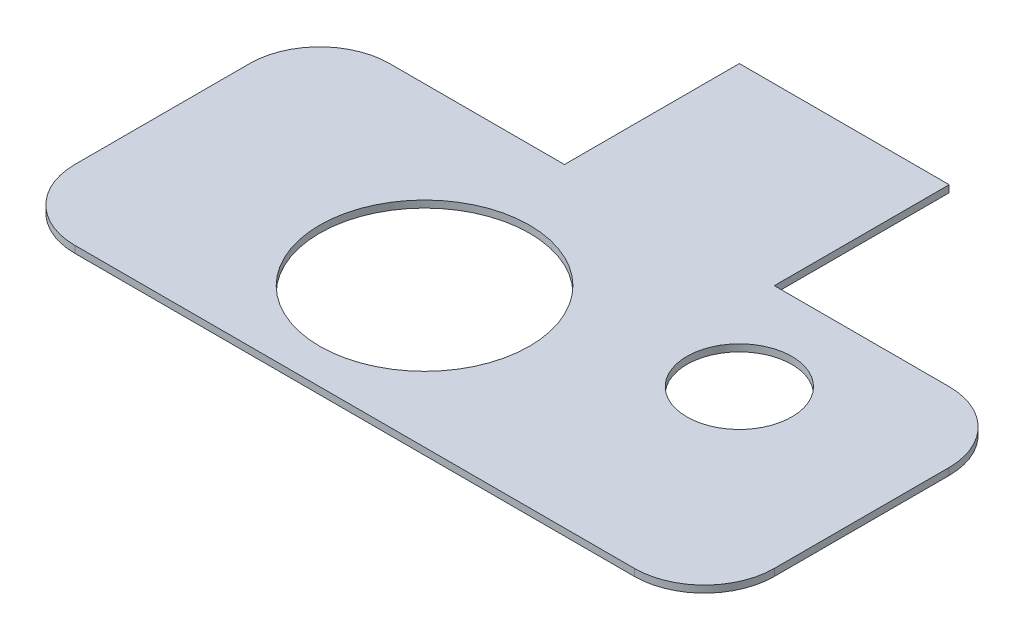
ISO-10303-21;
HEADER;
FILE_DESCRIPTION(('STEP AP214'),'2;1');
FILE_NAME('part.step','',(''),(''),'','','');
FILE_SCHEMA(('AUTOMOTIVE_DESIGN { 1 0 10303 214 1 1 1 1 }'));
ENDSEC;
DATA;
#1=APPLICATION_CONTEXT('core data for automotive mechanical design processes');
#2=APPLICATION_PROTOCOL_DEFINITION('international standard','automotive_design',2000,#1);
#3=PRODUCT_CONTEXT('',#1,'mechanical');
#4=PRODUCT('Part','Part','',(#3));
#5=PRODUCT_RELATED_PRODUCT_CATEGORY('part','',(#4));
#6=PRODUCT_DEFINITION_FORMATION('','',#4);
#7=PRODUCT_DEFINITION_CONTEXT('part definition',#1,'design');
#8=PRODUCT_DEFINITION('design','',#6,#7);
#9=PRODUCT_DEFINITION_SHAPE('','',#8);
#10=(LENGTH_UNIT() NAMED_UNIT(*) SI_UNIT(.MILLI.,.METRE.));
#11=(NAMED_UNIT(*) PLANE_ANGLE_UNIT() SI_UNIT($,.RADIAN.));
#12=(NAMED_UNIT(*) SI_UNIT($,.STERADIAN.) SOLID_ANGLE_UNIT());
#13=UNCERTAINTY_MEASURE_WITH_UNIT(LENGTH_MEASURE(1.E-05),#10,'distance_accuracy_value','');
#14=(GEOMETRIC_REPRESENTATION_CONTEXT(3) GLOBAL_UNCERTAINTY_ASSIGNED_CONTEXT((#13)) GLOBAL_UNIT_ASSIGNED_CONTEXT((#10,
#11,#12)) REPRESENTATION_CONTEXT('',''));
#15=CARTESIAN_POINT('',(0.,0.,0.));
#16=DIRECTION('',(0.,0.,1.));
#17=DIRECTION('',(1.,0.,0.));
#18=AXIS2_PLACEMENT_3D('',#15,#16,#17);
#19=CARTESIAN_POINT('',(90.,1.,-35.));
#20=DIRECTION('',(0.,-1.,0.));
#21=DIRECTION('',(0.,0.,-1.));
#22=AXIS2_PLACEMENT_3D('',#19,#20,#21);
#23=PLANE('',#22);
#24=DIRECTION('',(0.,0.,1.));
#25=VECTOR('',#24,1.);
#26=CARTESIAN_POINT('',(35.,1.,-45.));
#27=LINE('',#26,#25);
#28=CARTESIAN_POINT('',(35.,1.,-70.));
#29=VERTEX_POINT('',#28);
#30=CARTESIAN_POINT('',(35.,1.,-45.));
#31=VERTEX_POINT('',#30);
#32=EDGE_CURVE('E181',#29,#31,#27,.T.);
#33=ORIENTED_EDGE('',*,*,#32,.T.);
#34=DIRECTION('',(-1.,0.,0.));
#35=VECTOR('',#34,1.);
#36=CARTESIAN_POINT('',(10.0000000000001,1.,-45.));
#37=LINE('',#36,#35);
#38=CARTESIAN_POINT('',(10.0000000000001,1.,-45.));
#39=VERTEX_POINT('',#38);
#40=EDGE_CURVE('E109',#31,#39,#37,.T.);
#41=ORIENTED_EDGE('',*,*,#40,.T.);
#42=CARTESIAN_POINT('',(10.,1.,-35.));
#43=DIRECTION('',(0.,1.,0.));
#44=DIRECTION('',(0.,0.,-1.));
#45=AXIS2_PLACEMENT_3D('',#42,#43,#44);
#46=CIRCLE('',#45,10.);
#47=CARTESIAN_POINT('',(0.,1.,-34.9999999999999));
#48=VERTEX_POINT('',#47);
#49=EDGE_CURVE('E208',#39,#48,#46,.T.);
#50=ORIENTED_EDGE('',*,*,#49,.T.);
#51=DIRECTION('',(0.,0.,1.));
#52=VECTOR('',#51,1.);
#53=CARTESIAN_POINT('',(0.,1.,-10.0000000000001));
#54=LINE('',#53,#52);
#55=CARTESIAN_POINT('',(0.,1.,-10.0000000000001));
#56=VERTEX_POINT('',#55);
#57=EDGE_CURVE('E227',#48,#56,#54,.T.);
#58=ORIENTED_EDGE('',*,*,#57,.T.);
#59=CARTESIAN_POINT('',(10.,1.,-10.));
#60=DIRECTION('',(0.,1.,0.));
#61=DIRECTION('',(0.,0.,-1.));
#62=AXIS2_PLACEMENT_3D('',#59,#60,#61);
#63=CIRCLE('',#62,10.);
#64=CARTESIAN_POINT('',(10.0000000000001,1.,0.));
#65=VERTEX_POINT('',#64);
#66=EDGE_CURVE('E224',#56,#65,#63,.T.);
#67=ORIENTED_EDGE('',*,*,#66,.T.);
#68=DIRECTION('',(1.,0.,0.));
#69=VECTOR('',#68,1.);
#70=CARTESIAN_POINT('',(10.0000000000001,1.,0.));
#71=LINE('',#70,#69);
#72=CARTESIAN_POINT('',(89.9999999999999,1.,0.));
#73=VERTEX_POINT('',#72);
#74=EDGE_CURVE('E226',#65,#73,#71,.T.);
#75=ORIENTED_EDGE('',*,*,#74,.T.);
#76=CARTESIAN_POINT('',(90.,1.,-10.));
#77=DIRECTION('',(0.,1.,0.));
#78=DIRECTION('',(0.,0.,1.));
#79=AXIS2_PLACEMENT_3D('',#76,#77,#78);
#80=CIRCLE('',#79,10.);
#81=CARTESIAN_POINT('',(100.,1.,-10.0000000000001));
#82=VERTEX_POINT('',#81);
#83=EDGE_CURVE('E229',#73,#82,#80,.T.);
#84=ORIENTED_EDGE('',*,*,#83,.T.);
#85=DIRECTION('',(0.,0.,-1.));
#86=VECTOR('',#85,1.);
#87=CARTESIAN_POINT('',(100.,1.,-10.0000000000001));
#88=LINE('',#87,#86);
#89=CARTESIAN_POINT('',(100.,1.,-34.9999999999999));
#90=VERTEX_POINT('',#89);
#91=EDGE_CURVE('E235',#82,#90,#88,.T.);
#92=ORIENTED_EDGE('',*,*,#91,.T.);
#93=CARTESIAN_POINT('',(90.,1.,-35.));
#94=DIRECTION('',(0.,1.,0.));
#95=DIRECTION('',(0.,0.,-1.));
#96=AXIS2_PLACEMENT_3D('',#93,#94,#95);
#97=CIRCLE('',#96,10.);
#98=CARTESIAN_POINT('',(89.9999999999999,1.,-45.));
#99=VERTEX_POINT('',#98);
#100=EDGE_CURVE('E140',#90,#99,#97,.T.);
#101=ORIENTED_EDGE('',*,*,#100,.T.);
#102=DIRECTION('',(-1.,0.,0.));
#103=VECTOR('',#102,1.);
#104=CARTESIAN_POINT('',(65.,1.,-45.));
#105=LINE('',#104,#103);
#106=CARTESIAN_POINT('',(65.,1.,-45.));
#107=VERTEX_POINT('',#106);
#108=EDGE_CURVE('E134',#99,#107,#105,.T.);
#109=ORIENTED_EDGE('',*,*,#108,.T.);
#110=DIRECTION('',(0.,0.,-1.));
#111=VECTOR('',#110,1.);
#112=CARTESIAN_POINT('',(65.,1.,-45.));
#113=LINE('',#112,#111);
#114=CARTESIAN_POINT('',(65.,1.,-70.));
#115=VERTEX_POINT('',#114);
#116=EDGE_CURVE('E138',#107,#115,#113,.T.);
#117=ORIENTED_EDGE('',*,*,#116,.T.);
#118=DIRECTION('',(-1.,0.,0.));
#119=VECTOR('',#118,1.);
#120=CARTESIAN_POINT('',(35.,1.,-70.));
#121=LINE('',#120,#119);
#122=EDGE_CURVE('E54',#115,#29,#121,.T.);
#123=ORIENTED_EDGE('',*,*,#122,.T.);
#124=EDGE_LOOP('',(#33,#41,#50,#58,#67,#75,#84,#92,#101,#109,#117,#123));
#125=FACE_BOUND('',#124,.T.);
#126=CARTESIAN_POINT('',(40.,1.,-20.));
#127=DIRECTION('',(0.,1.,0.));
#128=DIRECTION('',(0.,0.,1.));
#129=AXIS2_PLACEMENT_3D('',#126,#127,#128);
#130=CIRCLE('',#129,15.);
#131=CARTESIAN_POINT('',(40.,1.,-5.));
#132=VERTEX_POINT('',#131);
#133=EDGE_CURVE('E162',#132,#132,#130,.T.);
#134=ORIENTED_EDGE('',*,*,#133,.F.);
#135=EDGE_LOOP('',(#134));
#136=FACE_BOUND('',#135,.T.);
#137=CARTESIAN_POINT('',(75.,1.,-30.));
#138=DIRECTION('',(0.,1.,0.));
#139=DIRECTION('',(0.,0.,1.));
#140=AXIS2_PLACEMENT_3D('',#137,#138,#139);
#141=CIRCLE('',#140,7.50000000000001);
#142=CARTESIAN_POINT('',(75.,1.,-22.5));
#143=VERTEX_POINT('',#142);
#144=EDGE_CURVE('E276',#143,#143,#141,.T.);
#145=ORIENTED_EDGE('',*,*,#144,.F.);
#146=EDGE_LOOP('',(#145));
#147=FACE_BOUND('',#146,.T.);
#148=ADVANCED_FACE('F37',(#125,#136,#147),#23,.F.);
#149=CARTESIAN_POINT('',(90.,0.,-35.));
#150=DIRECTION('',(0.,-1.,0.));
#151=DIRECTION('',(0.,0.,-1.));
#152=AXIS2_PLACEMENT_3D('',#149,#150,#151);
#153=PLANE('',#152);
#154=CARTESIAN_POINT('',(40.,0.,-20.));
#155=DIRECTION('',(0.,1.,0.));
#156=DIRECTION('',(0.,0.,1.));
#157=AXIS2_PLACEMENT_3D('',#154,#155,#156);
#158=CIRCLE('',#157,15.);
#159=CARTESIAN_POINT('',(40.,0.,-5.));
#160=VERTEX_POINT('',#159);
#161=EDGE_CURVE('E281',#160,#160,#158,.T.);
#162=ORIENTED_EDGE('',*,*,#161,.T.);
#163=EDGE_LOOP('',(#162));
#164=FACE_BOUND('',#163,.T.);
#165=DIRECTION('',(0.,0.,1.));
#166=VECTOR('',#165,1.);
#167=CARTESIAN_POINT('',(35.,0.,-45.));
#168=LINE('',#167,#166);
#169=CARTESIAN_POINT('',(35.,0.,-70.));
#170=VERTEX_POINT('',#169);
#171=CARTESIAN_POINT('',(35.,0.,-45.));
#172=VERTEX_POINT('',#171);
#173=EDGE_CURVE('E158',#170,#172,#168,.T.);
#174=ORIENTED_EDGE('',*,*,#173,.F.);
#175=DIRECTION('',(-1.,0.,0.));
#176=VECTOR('',#175,1.);
#177=CARTESIAN_POINT('',(35.,0.,-70.));
#178=LINE('',#177,#176);
#179=CARTESIAN_POINT('',(65.,0.,-70.));
#180=VERTEX_POINT('',#179);
#181=EDGE_CURVE('E101',#180,#170,#178,.T.);
#182=ORIENTED_EDGE('',*,*,#181,.F.);
#183=DIRECTION('',(0.,0.,-1.));
#184=VECTOR('',#183,1.);
#185=CARTESIAN_POINT('',(65.,0.,-45.));
#186=LINE('',#185,#184);
#187=CARTESIAN_POINT('',(65.,0.,-45.));
#188=VERTEX_POINT('',#187);
#189=EDGE_CURVE('E95',#188,#180,#186,.T.);
#190=ORIENTED_EDGE('',*,*,#189,.F.);
#191=DIRECTION('',(-1.,0.,0.));
#192=VECTOR('',#191,1.);
#193=CARTESIAN_POINT('',(65.,0.,-45.));
#194=LINE('',#193,#192);
#195=CARTESIAN_POINT('',(89.9999999999999,0.,-45.));
#196=VERTEX_POINT('',#195);
#197=EDGE_CURVE('E148',#196,#188,#194,.T.);
#198=ORIENTED_EDGE('',*,*,#197,.F.);
#199=CARTESIAN_POINT('',(90.,0.,-35.));
#200=DIRECTION('',(0.,1.,0.));
#201=DIRECTION('',(0.,0.,-1.));
#202=AXIS2_PLACEMENT_3D('',#199,#200,#201);
#203=CIRCLE('',#202,10.);
#204=CARTESIAN_POINT('',(100.,0.,-34.9999999999999));
#205=VERTEX_POINT('',#204);
#206=EDGE_CURVE('E176',#205,#196,#203,.T.);
#207=ORIENTED_EDGE('',*,*,#206,.F.);
#208=DIRECTION('',(0.,0.,-1.));
#209=VECTOR('',#208,1.);
#210=CARTESIAN_POINT('',(100.,0.,-10.0000000000001));
#211=LINE('',#210,#209);
#212=CARTESIAN_POINT('',(100.,0.,-10.0000000000001));
#213=VERTEX_POINT('',#212);
#214=EDGE_CURVE('E174',#213,#205,#211,.T.);
#215=ORIENTED_EDGE('',*,*,#214,.F.);
#216=CARTESIAN_POINT('',(90.,0.,-10.));
#217=DIRECTION('',(0.,1.,0.));
#218=DIRECTION('',(0.,0.,1.));
#219=AXIS2_PLACEMENT_3D('',#216,#217,#218);
#220=CIRCLE('',#219,10.);
#221=CARTESIAN_POINT('',(89.9999999999999,0.,0.));
#222=VERTEX_POINT('',#221);
#223=EDGE_CURVE('E172',#222,#213,#220,.T.);
#224=ORIENTED_EDGE('',*,*,#223,.F.);
#225=DIRECTION('',(1.,0.,0.));
#226=VECTOR('',#225,1.);
#227=CARTESIAN_POINT('',(10.0000000000001,0.,0.));
#228=LINE('',#227,#226);
#229=CARTESIAN_POINT('',(10.0000000000001,0.,0.));
#230=VERTEX_POINT('',#229);
#231=EDGE_CURVE('E170',#230,#222,#228,.T.);
#232=ORIENTED_EDGE('',*,*,#231,.F.);
#233=CARTESIAN_POINT('',(10.,0.,-10.));
#234=DIRECTION('',(0.,1.,0.));
#235=DIRECTION('',(0.,0.,-1.));
#236=AXIS2_PLACEMENT_3D('',#233,#234,#235);
#237=CIRCLE('',#236,10.);
#238=CARTESIAN_POINT('',(0.,0.,-10.0000000000001));
#239=VERTEX_POINT('',#238);
#240=EDGE_CURVE('E168',#239,#230,#237,.T.);
#241=ORIENTED_EDGE('',*,*,#240,.F.);
#242=DIRECTION('',(0.,0.,1.));
#243=VECTOR('',#242,1.);
#244=CARTESIAN_POINT('',(0.,0.,-10.0000000000001));
#245=LINE('',#244,#243);
#246=CARTESIAN_POINT('',(0.,0.,-34.9999999999999));
#247=VERTEX_POINT('',#246);
#248=EDGE_CURVE('E166',#247,#239,#245,.T.);
#249=ORIENTED_EDGE('',*,*,#248,.F.);
#250=CARTESIAN_POINT('',(10.,0.,-35.));
#251=DIRECTION('',(0.,1.,0.));
#252=DIRECTION('',(0.,0.,-1.));
#253=AXIS2_PLACEMENT_3D('',#250,#251,#252);
#254=CIRCLE('',#253,10.);
#255=CARTESIAN_POINT('',(10.0000000000001,0.,-45.));
#256=VERTEX_POINT('',#255);
#257=EDGE_CURVE('E164',#256,#247,#254,.T.);
#258=ORIENTED_EDGE('',*,*,#257,.F.);
#259=DIRECTION('',(-1.,0.,0.));
#260=VECTOR('',#259,1.);
#261=CARTESIAN_POINT('',(10.0000000000001,0.,-45.));
#262=LINE('',#261,#260);
#263=EDGE_CURVE('E161',#172,#256,#262,.T.);
#264=ORIENTED_EDGE('',*,*,#263,.F.);
#265=EDGE_LOOP('',(#174,#182,#190,#198,#207,#215,#224,#232,#241,#249,#258,#264));
#266=FACE_BOUND('',#265,.T.);
#267=CARTESIAN_POINT('',(75.,0.,-30.));
#268=DIRECTION('',(0.,1.,0.));
#269=DIRECTION('',(0.,0.,1.));
#270=AXIS2_PLACEMENT_3D('',#267,#268,#269);
#271=CIRCLE('',#270,7.50000000000001);
#272=CARTESIAN_POINT('',(75.,0.,-22.5));
#273=VERTEX_POINT('',#272);
#274=EDGE_CURVE('E279',#273,#273,#271,.T.);
#275=ORIENTED_EDGE('',*,*,#274,.T.);
#276=EDGE_LOOP('',(#275));
#277=FACE_BOUND('',#276,.T.);
#278=ADVANCED_FACE('F212',(#164,#266,#277),#153,.T.);
#279=CARTESIAN_POINT('',(35.,1.,-45.));
#280=DIRECTION('',(1.,0.,0.));
#281=DIRECTION('',(0.,0.,-1.));
#282=AXIS2_PLACEMENT_3D('',#279,#280,#281);
#283=PLANE('',#282);
#284=ORIENTED_EDGE('',*,*,#173,.T.);
#285=DIRECTION('',(0.,-1.,0.));
#286=VECTOR('',#285,1.);
#287=CARTESIAN_POINT('',(35.,1.,-45.));
#288=LINE('',#287,#286);
#289=EDGE_CURVE('E11',#31,#172,#288,.T.);
#290=ORIENTED_EDGE('',*,*,#289,.F.);
#291=ORIENTED_EDGE('',*,*,#32,.F.);
#292=DIRECTION('',(0.,-1.,0.));
#293=VECTOR('',#292,1.);
#294=CARTESIAN_POINT('',(35.,1.,-70.));
#295=LINE('',#294,#293);
#296=EDGE_CURVE('E154',#29,#170,#295,.T.);
#297=ORIENTED_EDGE('',*,*,#296,.T.);
#298=EDGE_LOOP('',(#284,#290,#291,#297));
#299=FACE_BOUND('',#298,.T.);
#300=ADVANCED_FACE('F39',(#299),#283,.F.);
#301=CARTESIAN_POINT('',(10.0000000000001,1.,-45.));
#302=DIRECTION('',(0.,0.,1.));
#303=DIRECTION('',(1.,0.,0.));
#304=AXIS2_PLACEMENT_3D('',#301,#302,#303);
#305=PLANE('',#304);
#306=ORIENTED_EDGE('',*,*,#263,.T.);
#307=DIRECTION('',(0.,-1.,0.));
#308=VECTOR('',#307,1.);
#309=CARTESIAN_POINT('',(10.0000000000001,1.,-45.));
#310=LINE('',#309,#308);
#311=EDGE_CURVE('E46',#39,#256,#310,.T.);
#312=ORIENTED_EDGE('',*,*,#311,.F.);
#313=ORIENTED_EDGE('',*,*,#40,.F.);
#314=ORIENTED_EDGE('',*,*,#289,.T.);
#315=EDGE_LOOP('',(#306,#312,#313,#314));
#316=FACE_BOUND('',#315,.T.);
#317=ADVANCED_FACE('F376',(#316),#305,.F.);
#318=CARTESIAN_POINT('',(10.,1.,-35.));
#319=DIRECTION('',(0.,-1.,0.));
#320=DIRECTION('',(0.,0.,-1.));
#321=AXIS2_PLACEMENT_3D('',#318,#319,#320);
#322=CYLINDRICAL_SURFACE('',#321,10.);
#323=ORIENTED_EDGE('',*,*,#257,.T.);
#324=DIRECTION('',(0.,-1.,0.));
#325=VECTOR('',#324,1.);
#326=CARTESIAN_POINT('',(0.,1.,-34.9999999999999));
#327=LINE('',#326,#325);
#328=EDGE_CURVE('E200',#48,#247,#327,.T.);
#329=ORIENTED_EDGE('',*,*,#328,.F.);
#330=ORIENTED_EDGE('',*,*,#49,.F.);
#331=ORIENTED_EDGE('',*,*,#311,.T.);
#332=EDGE_LOOP('',(#323,#329,#330,#331));
#333=FACE_BOUND('',#332,.T.);
#334=ADVANCED_FACE('F206',(#333),#322,.T.);
#335=CARTESIAN_POINT('',(0.,1.,-10.0000000000001));
#336=DIRECTION('',(1.,0.,0.));
#337=DIRECTION('',(0.,0.,-1.));
#338=AXIS2_PLACEMENT_3D('',#335,#336,#337);
#339=PLANE('',#338);
#340=ORIENTED_EDGE('',*,*,#248,.T.);
#341=DIRECTION('',(0.,-1.,0.));
#342=VECTOR('',#341,1.);
#343=CARTESIAN_POINT('',(0.,1.,-10.0000000000001));
#344=LINE('',#343,#342);
#345=EDGE_CURVE('E197',#56,#239,#344,.T.);
#346=ORIENTED_EDGE('',*,*,#345,.F.);
#347=ORIENTED_EDGE('',*,*,#57,.F.);
#348=ORIENTED_EDGE('',*,*,#328,.T.);
#349=EDGE_LOOP('',(#340,#346,#347,#348));
#350=FACE_BOUND('',#349,.T.);
#351=ADVANCED_FACE('F218',(#350),#339,.F.);
#352=CARTESIAN_POINT('',(10.,1.,-10.));
#353=DIRECTION('',(0.,-1.,0.));
#354=DIRECTION('',(0.,0.,-1.));
#355=AXIS2_PLACEMENT_3D('',#352,#353,#354);
#356=CYLINDRICAL_SURFACE('',#355,10.);
#357=ORIENTED_EDGE('',*,*,#240,.T.);
#358=DIRECTION('',(0.,-1.,0.));
#359=VECTOR('',#358,1.);
#360=CARTESIAN_POINT('',(10.0000000000001,1.,0.));
#361=LINE('',#360,#359);
#362=EDGE_CURVE('E194',#65,#230,#361,.T.);
#363=ORIENTED_EDGE('',*,*,#362,.F.);
#364=ORIENTED_EDGE('',*,*,#66,.F.);
#365=ORIENTED_EDGE('',*,*,#345,.T.);
#366=EDGE_LOOP('',(#357,#363,#364,#365));
#367=FACE_BOUND('',#366,.T.);
#368=ADVANCED_FACE('F222',(#367),#356,.T.);
#369=CARTESIAN_POINT('',(10.0000000000001,1.,0.));
#370=DIRECTION('',(0.,0.,-1.));
#371=DIRECTION('',(-1.,0.,0.));
#372=AXIS2_PLACEMENT_3D('',#369,#370,#371);
#373=PLANE('',#372);
#374=ORIENTED_EDGE('',*,*,#231,.T.);
#375=DIRECTION('',(0.,-1.,0.));
#376=VECTOR('',#375,1.);
#377=CARTESIAN_POINT('',(89.9999999999999,1.,0.));
#378=LINE('',#377,#376);
#379=EDGE_CURVE('E191',#73,#222,#378,.T.);
#380=ORIENTED_EDGE('',*,*,#379,.F.);
#381=ORIENTED_EDGE('',*,*,#74,.F.);
#382=ORIENTED_EDGE('',*,*,#362,.T.);
#383=EDGE_LOOP('',(#374,#380,#381,#382));
#384=FACE_BOUND('',#383,.T.);
#385=ADVANCED_FACE('F341',(#384),#373,.F.);
#386=CARTESIAN_POINT('',(90.,1.,-10.));
#387=DIRECTION('',(0.,-1.,0.));
#388=DIRECTION('',(0.,0.,-1.));
#389=AXIS2_PLACEMENT_3D('',#386,#387,#388);
#390=CYLINDRICAL_SURFACE('',#389,10.);
#391=ORIENTED_EDGE('',*,*,#223,.T.);
#392=DIRECTION('',(0.,-1.,0.));
#393=VECTOR('',#392,1.);
#394=CARTESIAN_POINT('',(100.,1.,-10.0000000000001));
#395=LINE('',#394,#393);
#396=EDGE_CURVE('E188',#82,#213,#395,.T.);
#397=ORIENTED_EDGE('',*,*,#396,.F.);
#398=ORIENTED_EDGE('',*,*,#83,.F.);
#399=ORIENTED_EDGE('',*,*,#379,.T.);
#400=EDGE_LOOP('',(#391,#397,#398,#399));
#401=FACE_BOUND('',#400,.T.);
#402=ADVANCED_FACE('F332',(#401),#390,.T.);
#403=CARTESIAN_POINT('',(100.,1.,-10.0000000000001));
#404=DIRECTION('',(-1.,0.,0.));
#405=DIRECTION('',(0.,0.,1.));
#406=AXIS2_PLACEMENT_3D('',#403,#404,#405);
#407=PLANE('',#406);
#408=ORIENTED_EDGE('',*,*,#214,.T.);
#409=DIRECTION('',(0.,-1.,0.));
#410=VECTOR('',#409,1.);
#411=CARTESIAN_POINT('',(100.,1.,-34.9999999999999));
#412=LINE('',#411,#410);
#413=EDGE_CURVE('E185',#90,#205,#412,.T.);
#414=ORIENTED_EDGE('',*,*,#413,.F.);
#415=ORIENTED_EDGE('',*,*,#91,.F.);
#416=ORIENTED_EDGE('',*,*,#396,.T.);
#417=EDGE_LOOP('',(#408,#414,#415,#416));
#418=FACE_BOUND('',#417,.T.);
#419=ADVANCED_FACE('F241',(#418),#407,.F.);
#420=CARTESIAN_POINT('',(90.,1.,-35.));
#421=DIRECTION('',(0.,-1.,0.));
#422=DIRECTION('',(0.,0.,-1.));
#423=AXIS2_PLACEMENT_3D('',#420,#421,#422);
#424=CYLINDRICAL_SURFACE('',#423,10.);
#425=ORIENTED_EDGE('',*,*,#206,.T.);
#426=DIRECTION('',(0.,-1.,0.));
#427=VECTOR('',#426,1.);
#428=CARTESIAN_POINT('',(89.9999999999999,1.,-45.));
#429=LINE('',#428,#427);
#430=EDGE_CURVE('E149',#99,#196,#429,.T.);
#431=ORIENTED_EDGE('',*,*,#430,.F.);
#432=ORIENTED_EDGE('',*,*,#100,.F.);
#433=ORIENTED_EDGE('',*,*,#413,.T.);
#434=EDGE_LOOP('',(#425,#431,#432,#433));
#435=FACE_BOUND('',#434,.T.);
#436=ADVANCED_FACE('F245',(#435),#424,.T.);
#437=CARTESIAN_POINT('',(65.,1.,-45.));
#438=DIRECTION('',(0.,0.,1.));
#439=DIRECTION('',(1.,0.,0.));
#440=AXIS2_PLACEMENT_3D('',#437,#438,#439);
#441=PLANE('',#440);
#442=ORIENTED_EDGE('',*,*,#197,.T.);
#443=DIRECTION('',(0.,-1.,0.));
#444=VECTOR('',#443,1.);
#445=CARTESIAN_POINT('',(65.,1.,-45.));
#446=LINE('',#445,#444);
#447=EDGE_CURVE('E145',#107,#188,#446,.T.);
#448=ORIENTED_EDGE('',*,*,#447,.F.);
#449=ORIENTED_EDGE('',*,*,#108,.F.);
#450=ORIENTED_EDGE('',*,*,#430,.T.);
#451=EDGE_LOOP('',(#442,#448,#449,#450));
#452=FACE_BOUND('',#451,.T.);
#453=ADVANCED_FACE('F146',(#452),#441,.F.);
#454=CARTESIAN_POINT('',(65.,1.,-45.));
#455=DIRECTION('',(-1.,0.,0.));
#456=DIRECTION('',(0.,0.,1.));
#457=AXIS2_PLACEMENT_3D('',#454,#455,#456);
#458=PLANE('',#457);
#459=ORIENTED_EDGE('',*,*,#189,.T.);
#460=DIRECTION('',(0.,-1.,0.));
#461=VECTOR('',#460,1.);
#462=CARTESIAN_POINT('',(65.,1.,-70.));
#463=LINE('',#462,#461);
#464=EDGE_CURVE('E150',#115,#180,#463,.T.);
#465=ORIENTED_EDGE('',*,*,#464,.F.);
#466=ORIENTED_EDGE('',*,*,#116,.F.);
#467=ORIENTED_EDGE('',*,*,#447,.T.);
#468=EDGE_LOOP('',(#459,#465,#466,#467));
#469=FACE_BOUND('',#468,.T.);
#470=ADVANCED_FACE('F152',(#469),#458,.F.);
#471=CARTESIAN_POINT('',(35.,1.,-70.));
#472=DIRECTION('',(0.,0.,1.));
#473=DIRECTION('',(1.,0.,0.));
#474=AXIS2_PLACEMENT_3D('',#471,#472,#473);
#475=PLANE('',#474);
#476=ORIENTED_EDGE('',*,*,#181,.T.);
#477=ORIENTED_EDGE('',*,*,#296,.F.);
#478=ORIENTED_EDGE('',*,*,#122,.F.);
#479=ORIENTED_EDGE('',*,*,#464,.T.);
#480=EDGE_LOOP('',(#476,#477,#478,#479));
#481=FACE_BOUND('',#480,.T.);
#482=ADVANCED_FACE('F249',(#481),#475,.F.);
#483=CARTESIAN_POINT('',(40.,1.,-20.));
#484=DIRECTION('',(0.,-1.,0.));
#485=DIRECTION('',(0.,0.,-1.));
#486=AXIS2_PLACEMENT_3D('',#483,#484,#485);
#487=CYLINDRICAL_SURFACE('',#486,15.);
#488=ORIENTED_EDGE('',*,*,#133,.T.);
#489=EDGE_LOOP('',(#488));
#490=FACE_BOUND('',#489,.T.);
#491=ORIENTED_EDGE('',*,*,#161,.F.);
#492=EDGE_LOOP('',(#491));
#493=FACE_BOUND('',#492,.T.);
#494=ADVANCED_FACE('F251',(#490,#493),#487,.F.);
#495=CARTESIAN_POINT('',(75.,1.,-30.));
#496=DIRECTION('',(0.,-1.,0.));
#497=DIRECTION('',(0.,0.,-1.));
#498=AXIS2_PLACEMENT_3D('',#495,#496,#497);
#499=CYLINDRICAL_SURFACE('',#498,7.50000000000001);
#500=ORIENTED_EDGE('',*,*,#144,.T.);
#501=EDGE_LOOP('',(#500));
#502=FACE_BOUND('',#501,.T.);
#503=ORIENTED_EDGE('',*,*,#274,.F.);
#504=EDGE_LOOP('',(#503));
#505=FACE_BOUND('',#504,.T.);
#506=ADVANCED_FACE('F257',(#502,#505),#499,.F.);
#507=CLOSED_SHELL('',(#148,#278,#300,#317,#334,#351,#368,#385,#402,#419,#436,#453,#470,#482,
#494,#506));
#508=MANIFOLD_SOLID_BREP('B2',#507);
#509=ADVANCED_BREP_SHAPE_REPRESENTATION('',(#18,#508),#14);
#510=SHAPE_DEFINITION_REPRESENTATION(#9,#509);
ENDSEC;
END-ISO-10303-21;
